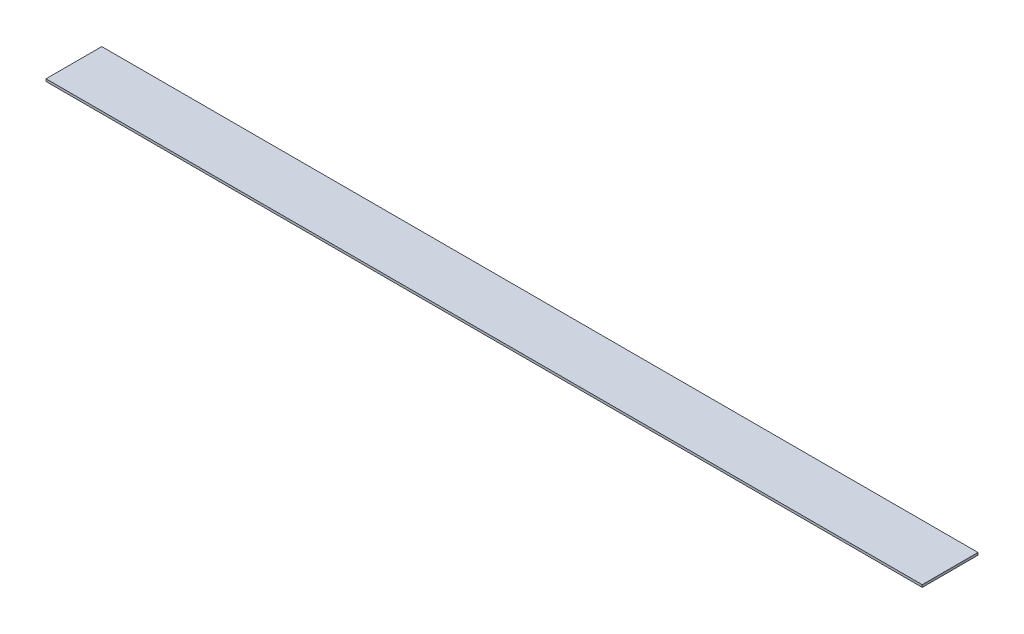
ISO-10303-21;
HEADER;
FILE_DESCRIPTION(('STEP AP214'),'2;1');
FILE_NAME('part.step','',(''),(''),'','','');
FILE_SCHEMA(('AUTOMOTIVE_DESIGN { 1 0 10303 214 1 1 1 1 }'));
ENDSEC;
DATA;
#1=APPLICATION_CONTEXT('core data for automotive mechanical design processes');
#2=APPLICATION_PROTOCOL_DEFINITION('international standard','automotive_design',2000,#1);
#3=PRODUCT_CONTEXT('',#1,'mechanical');
#4=PRODUCT('Part','Part','',(#3));
#5=PRODUCT_RELATED_PRODUCT_CATEGORY('part','',(#4));
#6=PRODUCT_DEFINITION_FORMATION('','',#4);
#7=PRODUCT_DEFINITION_CONTEXT('part definition',#1,'design');
#8=PRODUCT_DEFINITION('design','',#6,#7);
#9=PRODUCT_DEFINITION_SHAPE('','',#8);
#10=(LENGTH_UNIT() NAMED_UNIT(*) SI_UNIT(.MILLI.,.METRE.));
#11=(NAMED_UNIT(*) PLANE_ANGLE_UNIT() SI_UNIT($,.RADIAN.));
#12=(NAMED_UNIT(*) SI_UNIT($,.STERADIAN.) SOLID_ANGLE_UNIT());
#13=UNCERTAINTY_MEASURE_WITH_UNIT(LENGTH_MEASURE(1.E-05),#10,'distance_accuracy_value','');
#14=(GEOMETRIC_REPRESENTATION_CONTEXT(3) GLOBAL_UNCERTAINTY_ASSIGNED_CONTEXT((#13)) GLOBAL_UNIT_ASSIGNED_CONTEXT((#10,
#11,#12)) REPRESENTATION_CONTEXT('',''));
#15=CARTESIAN_POINT('',(0.,0.,0.));
#16=DIRECTION('',(0.,0.,1.));
#17=DIRECTION('',(1.,0.,0.));
#18=AXIS2_PLACEMENT_3D('',#15,#16,#17);
#19=CARTESIAN_POINT('',(-550.,3.,35.0000000000001));
#20=DIRECTION('',(1.,0.,0.));
#21=DIRECTION('',(0.,0.,-1.));
#22=AXIS2_PLACEMENT_3D('',#19,#20,#21);
#23=PLANE('',#22);
#24=DIRECTION('',(0.,0.,1.));
#25=VECTOR('',#24,1.);
#26=CARTESIAN_POINT('',(-550.,0.,35.0000000000001));
#27=LINE('',#26,#25);
#28=CARTESIAN_POINT('',(-550.,0.,-35.));
#29=VERTEX_POINT('',#28);
#30=CARTESIAN_POINT('',(-550.,0.,35.0000000000001));
#31=VERTEX_POINT('',#30);
#32=EDGE_CURVE('E96',#29,#31,#27,.T.);
#33=ORIENTED_EDGE('',*,*,#32,.T.);
#34=DIRECTION('',(0.,-1.,0.));
#35=VECTOR('',#34,1.);
#36=CARTESIAN_POINT('',(-550.,3.,35.0000000000001));
#37=LINE('',#36,#35);
#38=CARTESIAN_POINT('',(-550.,3.,35.0000000000001));
#39=VERTEX_POINT('',#38);
#40=EDGE_CURVE('E11',#39,#31,#37,.T.);
#41=ORIENTED_EDGE('',*,*,#40,.F.);
#42=DIRECTION('',(0.,0.,1.));
#43=VECTOR('',#42,1.);
#44=CARTESIAN_POINT('',(-550.,3.,35.0000000000001));
#45=LINE('',#44,#43);
#46=CARTESIAN_POINT('',(-550.,3.,-35.));
#47=VERTEX_POINT('',#46);
#48=EDGE_CURVE('E84',#47,#39,#45,.T.);
#49=ORIENTED_EDGE('',*,*,#48,.F.);
#50=DIRECTION('',(0.,-1.,0.));
#51=VECTOR('',#50,1.);
#52=CARTESIAN_POINT('',(-550.,3.,-35.));
#53=LINE('',#52,#51);
#54=EDGE_CURVE('E92',#47,#29,#53,.T.);
#55=ORIENTED_EDGE('',*,*,#54,.T.);
#56=EDGE_LOOP('',(#33,#41,#49,#55));
#57=FACE_BOUND('',#56,.T.);
#58=ADVANCED_FACE('F33',(#57),#23,.F.);
#59=CARTESIAN_POINT('',(550.,3.,34.9999999999999));
#60=DIRECTION('',(0.,0.,-1.));
#61=DIRECTION('',(-1.,0.,0.));
#62=AXIS2_PLACEMENT_3D('',#59,#60,#61);
#63=PLANE('',#62);
#64=DIRECTION('',(1.,0.,0.));
#65=VECTOR('',#64,1.);
#66=CARTESIAN_POINT('',(550.,0.,34.9999999999999));
#67=LINE('',#66,#65);
#68=CARTESIAN_POINT('',(550.,0.,34.9999999999999));
#69=VERTEX_POINT('',#68);
#70=EDGE_CURVE('E88',#31,#69,#67,.T.);
#71=ORIENTED_EDGE('',*,*,#70,.T.);
#72=DIRECTION('',(0.,-1.,0.));
#73=VECTOR('',#72,1.);
#74=CARTESIAN_POINT('',(550.,3.,34.9999999999999));
#75=LINE('',#74,#73);
#76=CARTESIAN_POINT('',(550.,3.,34.9999999999999));
#77=VERTEX_POINT('',#76);
#78=EDGE_CURVE('E41',#77,#69,#75,.T.);
#79=ORIENTED_EDGE('',*,*,#78,.F.);
#80=DIRECTION('',(1.,0.,0.));
#81=VECTOR('',#80,1.);
#82=CARTESIAN_POINT('',(550.,3.,34.9999999999999));
#83=LINE('',#82,#81);
#84=EDGE_CURVE('E79',#39,#77,#83,.T.);
#85=ORIENTED_EDGE('',*,*,#84,.F.);
#86=ORIENTED_EDGE('',*,*,#40,.T.);
#87=EDGE_LOOP('',(#71,#79,#85,#86));
#88=FACE_BOUND('',#87,.T.);
#89=ADVANCED_FACE('F87',(#88),#63,.F.);
#90=CARTESIAN_POINT('',(550.,3.,34.9999999999999));
#91=DIRECTION('',(-1.,0.,0.));
#92=DIRECTION('',(0.,0.,1.));
#93=AXIS2_PLACEMENT_3D('',#90,#91,#92);
#94=PLANE('',#93);
#95=DIRECTION('',(0.,0.,-1.));
#96=VECTOR('',#95,1.);
#97=CARTESIAN_POINT('',(550.,0.,34.9999999999999));
#98=LINE('',#97,#96);
#99=CARTESIAN_POINT('',(550.,0.,-35.0000000000001));
#100=VERTEX_POINT('',#99);
#101=EDGE_CURVE('E66',#69,#100,#98,.T.);
#102=ORIENTED_EDGE('',*,*,#101,.T.);
#103=DIRECTION('',(0.,-1.,0.));
#104=VECTOR('',#103,1.);
#105=CARTESIAN_POINT('',(550.,3.,-35.0000000000001));
#106=LINE('',#105,#104);
#107=CARTESIAN_POINT('',(550.,3.,-35.0000000000001));
#108=VERTEX_POINT('',#107);
#109=EDGE_CURVE('E89',#108,#100,#106,.T.);
#110=ORIENTED_EDGE('',*,*,#109,.F.);
#111=DIRECTION('',(0.,0.,-1.));
#112=VECTOR('',#111,1.);
#113=CARTESIAN_POINT('',(550.,3.,34.9999999999999));
#114=LINE('',#113,#112);
#115=EDGE_CURVE('E82',#77,#108,#114,.T.);
#116=ORIENTED_EDGE('',*,*,#115,.F.);
#117=ORIENTED_EDGE('',*,*,#78,.T.);
#118=EDGE_LOOP('',(#102,#110,#116,#117));
#119=FACE_BOUND('',#118,.T.);
#120=ADVANCED_FACE('F90',(#119),#94,.F.);
#121=CARTESIAN_POINT('',(550.,3.,-35.0000000000001));
#122=DIRECTION('',(0.,0.,1.));
#123=DIRECTION('',(1.,0.,0.));
#124=AXIS2_PLACEMENT_3D('',#121,#122,#123);
#125=PLANE('',#124);
#126=DIRECTION('',(-1.,0.,0.));
#127=VECTOR('',#126,1.);
#128=CARTESIAN_POINT('',(550.,0.,-35.0000000000001));
#129=LINE('',#128,#127);
#130=EDGE_CURVE('E72',#100,#29,#129,.T.);
#131=ORIENTED_EDGE('',*,*,#130,.T.);
#132=ORIENTED_EDGE('',*,*,#54,.F.);
#133=DIRECTION('',(-1.,0.,0.));
#134=VECTOR('',#133,1.);
#135=CARTESIAN_POINT('',(550.,3.,-35.0000000000001));
#136=LINE('',#135,#134);
#137=EDGE_CURVE('E49',#108,#47,#136,.T.);
#138=ORIENTED_EDGE('',*,*,#137,.F.);
#139=ORIENTED_EDGE('',*,*,#109,.T.);
#140=EDGE_LOOP('',(#131,#132,#138,#139));
#141=FACE_BOUND('',#140,.T.);
#142=ADVANCED_FACE('F103',(#141),#125,.F.);
#143=CARTESIAN_POINT('',(-550.,3.,-35.));
#144=DIRECTION('',(0.,1.,0.));
#145=DIRECTION('',(0.,0.,1.));
#146=AXIS2_PLACEMENT_3D('',#143,#144,#145);
#147=PLANE('',#146);
#148=ORIENTED_EDGE('',*,*,#48,.T.);
#149=ORIENTED_EDGE('',*,*,#84,.T.);
#150=ORIENTED_EDGE('',*,*,#115,.T.);
#151=ORIENTED_EDGE('',*,*,#137,.T.);
#152=EDGE_LOOP('',(#148,#149,#150,#151));
#153=FACE_BOUND('',#152,.T.);
#154=ADVANCED_FACE('F80',(#153),#147,.T.);
#155=CARTESIAN_POINT('',(-550.,0.,-35.));
#156=DIRECTION('',(0.,1.,0.));
#157=DIRECTION('',(0.,0.,1.));
#158=AXIS2_PLACEMENT_3D('',#155,#156,#157);
#159=PLANE('',#158);
#160=ORIENTED_EDGE('',*,*,#32,.F.);
#161=ORIENTED_EDGE('',*,*,#130,.F.);
#162=ORIENTED_EDGE('',*,*,#101,.F.);
#163=ORIENTED_EDGE('',*,*,#70,.F.);
#164=EDGE_LOOP('',(#160,#161,#162,#163));
#165=FACE_BOUND('',#164,.T.);
#166=ADVANCED_FACE('F106',(#165),#159,.F.);
#167=CLOSED_SHELL('',(#58,#89,#120,#142,#154,#166));
#168=MANIFOLD_SOLID_BREP('B2',#167);
#169=ADVANCED_BREP_SHAPE_REPRESENTATION('',(#18,#168),#14);
#170=SHAPE_DEFINITION_REPRESENTATION(#9,#169);
ENDSEC;
END-ISO-10303-21;
